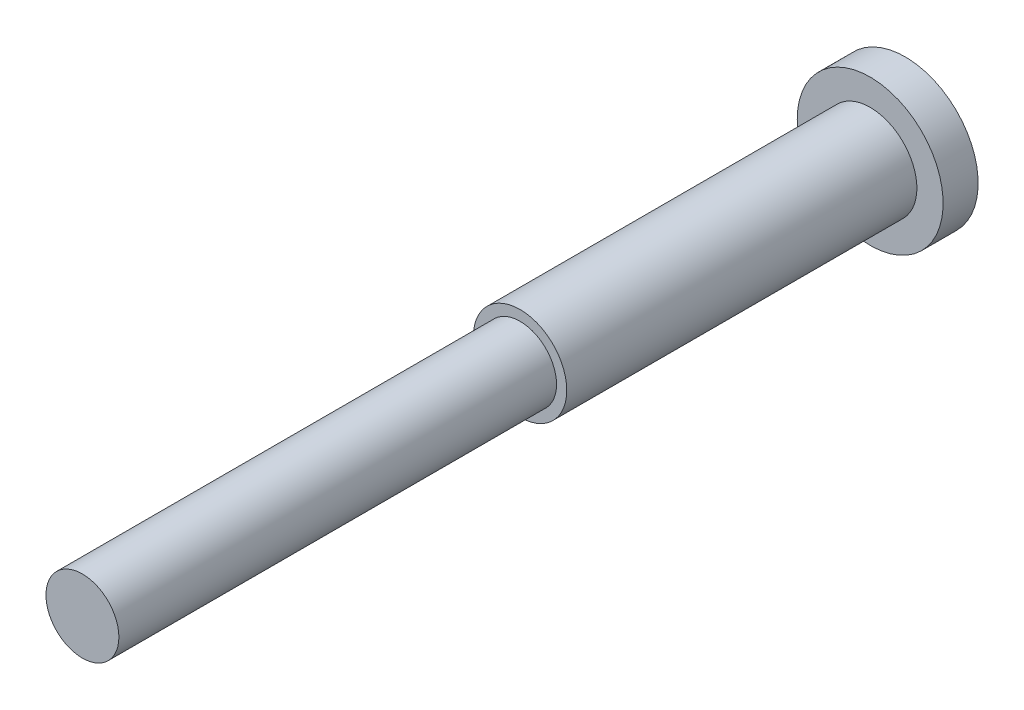
ISO-10303-21;
HEADER;
FILE_DESCRIPTION(('STEP AP214'),'2;1');
FILE_NAME('part.step','',(''),(''),'','','');
FILE_SCHEMA(('AUTOMOTIVE_DESIGN { 1 0 10303 214 1 1 1 1 }'));
ENDSEC;
DATA;
#1=APPLICATION_CONTEXT('core data for automotive mechanical design processes');
#2=APPLICATION_PROTOCOL_DEFINITION('international standard','automotive_design',2000,#1);
#3=PRODUCT_CONTEXT('',#1,'mechanical');
#4=PRODUCT('Part','Part','',(#3));
#5=PRODUCT_RELATED_PRODUCT_CATEGORY('part','',(#4));
#6=PRODUCT_DEFINITION_FORMATION('','',#4);
#7=PRODUCT_DEFINITION_CONTEXT('part definition',#1,'design');
#8=PRODUCT_DEFINITION('design','',#6,#7);
#9=PRODUCT_DEFINITION_SHAPE('','',#8);
#10=(LENGTH_UNIT() NAMED_UNIT(*) SI_UNIT(.MILLI.,.METRE.));
#11=(NAMED_UNIT(*) PLANE_ANGLE_UNIT() SI_UNIT($,.RADIAN.));
#12=(NAMED_UNIT(*) SI_UNIT($,.STERADIAN.) SOLID_ANGLE_UNIT());
#13=UNCERTAINTY_MEASURE_WITH_UNIT(LENGTH_MEASURE(1.E-05),#10,'distance_accuracy_value','');
#14=(GEOMETRIC_REPRESENTATION_CONTEXT(3) GLOBAL_UNCERTAINTY_ASSIGNED_CONTEXT((#13)) GLOBAL_UNIT_ASSIGNED_CONTEXT((#10,
#11,#12)) REPRESENTATION_CONTEXT('',''));
#15=CARTESIAN_POINT('',(0.,0.,0.));
#16=DIRECTION('',(0.,0.,1.));
#17=DIRECTION('',(1.,0.,0.));
#18=AXIS2_PLACEMENT_3D('',#15,#16,#17);
#19=CARTESIAN_POINT('',(0.,0.,60.));
#20=DIRECTION('',(0.,0.,-1.));
#21=DIRECTION('',(-1.,0.,0.));
#22=AXIS2_PLACEMENT_3D('',#19,#20,#21);
#23=CYLINDRICAL_SURFACE('',#22,8.);
#24=CARTESIAN_POINT('',(0.,0.,60.));
#25=DIRECTION('',(0.,0.,1.));
#26=DIRECTION('',(1.,0.,0.));
#27=AXIS2_PLACEMENT_3D('',#24,#25,#26);
#28=CIRCLE('',#27,8.);
#29=CARTESIAN_POINT('',(8.,0.,60.));
#30=VERTEX_POINT('',#29);
#31=EDGE_CURVE('E10',#30,#30,#28,.T.);
#32=ORIENTED_EDGE('',*,*,#31,.F.);
#33=EDGE_LOOP('',(#32));
#34=FACE_BOUND('',#33,.T.);
#35=CARTESIAN_POINT('',(0.,0.,0.));
#36=DIRECTION('',(0.,0.,-1.));
#37=DIRECTION('',(-1.,0.,0.));
#38=AXIS2_PLACEMENT_3D('',#35,#36,#37);
#39=CIRCLE('',#38,8.);
#40=CARTESIAN_POINT('',(-8.,0.,0.));
#41=VERTEX_POINT('',#40);
#42=EDGE_CURVE('E52',#41,#41,#39,.T.);
#43=ORIENTED_EDGE('',*,*,#42,.F.);
#44=EDGE_LOOP('',(#43));
#45=FACE_BOUND('',#44,.T.);
#46=ADVANCED_FACE('F37',(#34,#45),#23,.T.);
#47=CARTESIAN_POINT('',(0.,0.,60.));
#48=DIRECTION('',(0.,0.,1.));
#49=DIRECTION('',(1.,0.,0.));
#50=AXIS2_PLACEMENT_3D('',#47,#48,#49);
#51=PLANE('',#50);
#52=CARTESIAN_POINT('',(0.,0.,60.));
#53=DIRECTION('',(0.,0.,1.));
#54=DIRECTION('',(1.,0.,0.));
#55=AXIS2_PLACEMENT_3D('',#52,#53,#54);
#56=CIRCLE('',#55,6.25);
#57=CARTESIAN_POINT('',(6.25,0.,60.));
#58=VERTEX_POINT('',#57);
#59=EDGE_CURVE('E47',#58,#58,#56,.T.);
#60=ORIENTED_EDGE('',*,*,#59,.F.);
#61=EDGE_LOOP('',(#60));
#62=FACE_BOUND('',#61,.T.);
#63=ORIENTED_EDGE('',*,*,#31,.T.);
#64=EDGE_LOOP('',(#63));
#65=FACE_BOUND('',#64,.T.);
#66=ADVANCED_FACE('F81',(#62,#65),#51,.T.);
#67=CARTESIAN_POINT('',(0.,0.,135.));
#68=DIRECTION('',(0.,0.,-1.));
#69=DIRECTION('',(-1.,0.,0.));
#70=AXIS2_PLACEMENT_3D('',#67,#68,#69);
#71=CYLINDRICAL_SURFACE('',#70,6.25);
#72=CARTESIAN_POINT('',(0.,0.,135.));
#73=DIRECTION('',(0.,0.,1.));
#74=DIRECTION('',(1.,0.,0.));
#75=AXIS2_PLACEMENT_3D('',#72,#73,#74);
#76=CIRCLE('',#75,6.25);
#77=CARTESIAN_POINT('',(6.25,0.,135.));
#78=VERTEX_POINT('',#77);
#79=EDGE_CURVE('E43',#78,#78,#76,.T.);
#80=ORIENTED_EDGE('',*,*,#79,.F.);
#81=EDGE_LOOP('',(#80));
#82=FACE_BOUND('',#81,.T.);
#83=ORIENTED_EDGE('',*,*,#59,.T.);
#84=EDGE_LOOP('',(#83));
#85=FACE_BOUND('',#84,.T.);
#86=ADVANCED_FACE('F86',(#82,#85),#71,.T.);
#87=CARTESIAN_POINT('',(0.,0.,135.));
#88=DIRECTION('',(0.,0.,1.));
#89=DIRECTION('',(1.,0.,0.));
#90=AXIS2_PLACEMENT_3D('',#87,#88,#89);
#91=PLANE('',#90);
#92=ORIENTED_EDGE('',*,*,#79,.T.);
#93=EDGE_LOOP('',(#92));
#94=FACE_BOUND('',#93,.T.);
#95=ADVANCED_FACE('F68',(#94),#91,.T.);
#96=CARTESIAN_POINT('',(0.,0.,-6.));
#97=DIRECTION('',(0.,0.,1.));
#98=DIRECTION('',(1.,0.,0.));
#99=AXIS2_PLACEMENT_3D('',#96,#97,#98);
#100=CYLINDRICAL_SURFACE('',#99,12.5);
#101=CARTESIAN_POINT('',(0.,0.,-6.));
#102=DIRECTION('',(0.,0.,-1.));
#103=DIRECTION('',(-1.,0.,0.));
#104=AXIS2_PLACEMENT_3D('',#101,#102,#103);
#105=CIRCLE('',#104,12.5);
#106=CARTESIAN_POINT('',(-12.5,0.,-6.));
#107=VERTEX_POINT('',#106);
#108=EDGE_CURVE('E56',#107,#107,#105,.T.);
#109=ORIENTED_EDGE('',*,*,#108,.F.);
#110=EDGE_LOOP('',(#109));
#111=FACE_BOUND('',#110,.T.);
#112=CARTESIAN_POINT('',(0.,0.,0.));
#113=DIRECTION('',(0.,0.,-1.));
#114=DIRECTION('',(-1.,0.,0.));
#115=AXIS2_PLACEMENT_3D('',#112,#113,#114);
#116=CIRCLE('',#115,12.5);
#117=CARTESIAN_POINT('',(-12.5,0.,0.));
#118=VERTEX_POINT('',#117);
#119=EDGE_CURVE('E57',#118,#118,#116,.T.);
#120=ORIENTED_EDGE('',*,*,#119,.T.);
#121=EDGE_LOOP('',(#120));
#122=FACE_BOUND('',#121,.T.);
#123=ADVANCED_FACE('F65',(#111,#122),#100,.T.);
#124=CARTESIAN_POINT('',(0.,0.,-6.));
#125=DIRECTION('',(0.,0.,-1.));
#126=DIRECTION('',(-1.,0.,0.));
#127=AXIS2_PLACEMENT_3D('',#124,#125,#126);
#128=PLANE('',#127);
#129=ORIENTED_EDGE('',*,*,#108,.T.);
#130=EDGE_LOOP('',(#129));
#131=FACE_BOUND('',#130,.T.);
#132=ADVANCED_FACE('F63',(#131),#128,.T.);
#133=CARTESIAN_POINT('',(0.,0.,0.));
#134=DIRECTION('',(0.,0.,-1.));
#135=DIRECTION('',(-1.,0.,0.));
#136=AXIS2_PLACEMENT_3D('',#133,#134,#135);
#137=PLANE('',#136);
#138=ORIENTED_EDGE('',*,*,#42,.T.);
#139=EDGE_LOOP('',(#138));
#140=FACE_BOUND('',#139,.T.);
#141=ORIENTED_EDGE('',*,*,#119,.F.);
#142=EDGE_LOOP('',(#141));
#143=FACE_BOUND('',#142,.T.);
#144=ADVANCED_FACE('F72',(#140,#143),#137,.F.);
#145=CLOSED_SHELL('',(#46,#66,#86,#95,#123,#132,#144));
#146=MANIFOLD_SOLID_BREP('B2',#145);
#147=ADVANCED_BREP_SHAPE_REPRESENTATION('',(#18,#146),#14);
#148=SHAPE_DEFINITION_REPRESENTATION(#9,#147);
ENDSEC;
END-ISO-10303-21;
